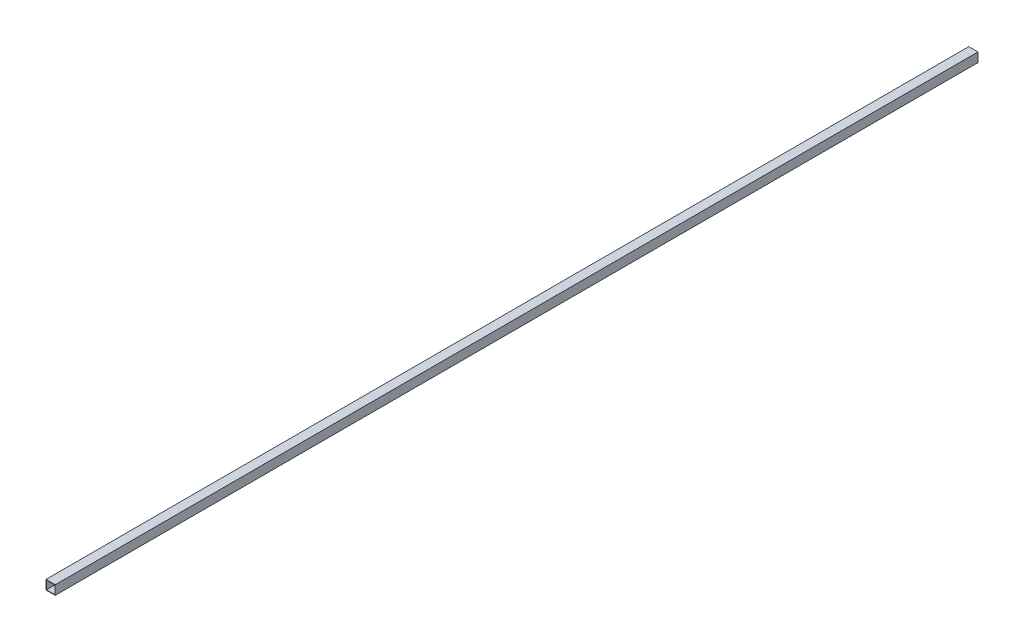
ISO-10303-21;
HEADER;
FILE_DESCRIPTION(('STEP AP214'),'2;1');
FILE_NAME('part.step','',(''),(''),'','','');
FILE_SCHEMA(('AUTOMOTIVE_DESIGN { 1 0 10303 214 1 1 1 1 }'));
ENDSEC;
DATA;
#1=APPLICATION_CONTEXT('core data for automotive mechanical design processes');
#2=APPLICATION_PROTOCOL_DEFINITION('international standard','automotive_design',2000,#1);
#3=PRODUCT_CONTEXT('',#1,'mechanical');
#4=PRODUCT('Part','Part','',(#3));
#5=PRODUCT_RELATED_PRODUCT_CATEGORY('part','',(#4));
#6=PRODUCT_DEFINITION_FORMATION('','',#4);
#7=PRODUCT_DEFINITION_CONTEXT('part definition',#1,'design');
#8=PRODUCT_DEFINITION('design','',#6,#7);
#9=PRODUCT_DEFINITION_SHAPE('','',#8);
#10=(LENGTH_UNIT() NAMED_UNIT(*) SI_UNIT(.MILLI.,.METRE.));
#11=(NAMED_UNIT(*) PLANE_ANGLE_UNIT() SI_UNIT($,.RADIAN.));
#12=(NAMED_UNIT(*) SI_UNIT($,.STERADIAN.) SOLID_ANGLE_UNIT());
#13=UNCERTAINTY_MEASURE_WITH_UNIT(LENGTH_MEASURE(1.E-05),#10,'distance_accuracy_value','');
#14=(GEOMETRIC_REPRESENTATION_CONTEXT(3) GLOBAL_UNCERTAINTY_ASSIGNED_CONTEXT((#13)) GLOBAL_UNIT_ASSIGNED_CONTEXT((#10,
#11,#12)) REPRESENTATION_CONTEXT('',''));
#15=CARTESIAN_POINT('',(0.,0.,0.));
#16=DIRECTION('',(0.,0.,1.));
#17=DIRECTION('',(1.,0.,0.));
#18=AXIS2_PLACEMENT_3D('',#15,#16,#17);
#19=CARTESIAN_POINT('',(0.,0.,100000.));
#20=DIRECTION('',(0.,0.,-1.));
#21=DIRECTION('',(-1.,0.,0.));
#22=AXIS2_PLACEMENT_3D('',#19,#20,#21);
#23=PLANE('',#22);
#24=DIRECTION('',(0.,1.,0.));
#25=VECTOR('',#24,1.);
#26=CARTESIAN_POINT('',(500.,-500.,100000.));
#27=LINE('',#26,#25);
#28=CARTESIAN_POINT('',(500.,-500.,100000.));
#29=VERTEX_POINT('',#28);
#30=CARTESIAN_POINT('',(500.,500.,100000.));
#31=VERTEX_POINT('',#30);
#32=EDGE_CURVE('E134',#29,#31,#27,.T.);
#33=ORIENTED_EDGE('',*,*,#32,.T.);
#34=DIRECTION('',(-1.,0.,0.));
#35=VECTOR('',#34,1.);
#36=CARTESIAN_POINT('',(-500.,500.,100000.));
#37=LINE('',#36,#35);
#38=CARTESIAN_POINT('',(-500.,500.,100000.));
#39=VERTEX_POINT('',#38);
#40=EDGE_CURVE('E137',#31,#39,#37,.T.);
#41=ORIENTED_EDGE('',*,*,#40,.T.);
#42=DIRECTION('',(0.,-1.,0.));
#43=VECTOR('',#42,1.);
#44=CARTESIAN_POINT('',(-500.,-500.,100000.));
#45=LINE('',#44,#43);
#46=CARTESIAN_POINT('',(-500.,-500.,100000.));
#47=VERTEX_POINT('',#46);
#48=EDGE_CURVE('E140',#39,#47,#45,.T.);
#49=ORIENTED_EDGE('',*,*,#48,.T.);
#50=DIRECTION('',(1.,0.,0.));
#51=VECTOR('',#50,1.);
#52=CARTESIAN_POINT('',(-500.,-500.,100000.));
#53=LINE('',#52,#51);
#54=EDGE_CURVE('E142',#47,#29,#53,.T.);
#55=ORIENTED_EDGE('',*,*,#54,.T.);
#56=EDGE_LOOP('',(#33,#41,#49,#55));
#57=FACE_BOUND('',#56,.T.);
#58=DIRECTION('',(0.,-1.,0.));
#59=VECTOR('',#58,1.);
#60=CARTESIAN_POINT('',(-450.,-450.,100000.));
#61=LINE('',#60,#59);
#62=CARTESIAN_POINT('',(-450.,450.,100000.));
#63=VERTEX_POINT('',#62);
#64=CARTESIAN_POINT('',(-450.,-450.,100000.));
#65=VERTEX_POINT('',#64);
#66=EDGE_CURVE('E98',#63,#65,#61,.T.);
#67=ORIENTED_EDGE('',*,*,#66,.F.);
#68=DIRECTION('',(-1.,0.,0.));
#69=VECTOR('',#68,1.);
#70=CARTESIAN_POINT('',(-450.,450.,100000.));
#71=LINE('',#70,#69);
#72=CARTESIAN_POINT('',(450.,450.,100000.));
#73=VERTEX_POINT('',#72);
#74=EDGE_CURVE('E120',#73,#63,#71,.T.);
#75=ORIENTED_EDGE('',*,*,#74,.F.);
#76=DIRECTION('',(0.,1.,0.));
#77=VECTOR('',#76,1.);
#78=CARTESIAN_POINT('',(450.,-450.,100000.));
#79=LINE('',#78,#77);
#80=CARTESIAN_POINT('',(450.,-450.,100000.));
#81=VERTEX_POINT('',#80);
#82=EDGE_CURVE('E118',#81,#73,#79,.T.);
#83=ORIENTED_EDGE('',*,*,#82,.F.);
#84=DIRECTION('',(1.,0.,0.));
#85=VECTOR('',#84,1.);
#86=CARTESIAN_POINT('',(-450.,-450.,100000.));
#87=LINE('',#86,#85);
#88=EDGE_CURVE('E106',#65,#81,#87,.T.);
#89=ORIENTED_EDGE('',*,*,#88,.F.);
#90=EDGE_LOOP('',(#67,#75,#83,#89));
#91=FACE_BOUND('',#90,.T.);
#92=ADVANCED_FACE('F33',(#57,#91),#23,.F.);
#93=CARTESIAN_POINT('',(0.,0.,0.));
#94=DIRECTION('',(0.,0.,-1.));
#95=DIRECTION('',(-1.,0.,0.));
#96=AXIS2_PLACEMENT_3D('',#93,#94,#95);
#97=PLANE('',#96);
#98=DIRECTION('',(0.,1.,0.));
#99=VECTOR('',#98,1.);
#100=CARTESIAN_POINT('',(500.,-500.,0.));
#101=LINE('',#100,#99);
#102=CARTESIAN_POINT('',(500.,-500.,0.));
#103=VERTEX_POINT('',#102);
#104=CARTESIAN_POINT('',(500.,500.,0.));
#105=VERTEX_POINT('',#104);
#106=EDGE_CURVE('E114',#103,#105,#101,.T.);
#107=ORIENTED_EDGE('',*,*,#106,.F.);
#108=DIRECTION('',(1.,0.,0.));
#109=VECTOR('',#108,1.);
#110=CARTESIAN_POINT('',(-500.,-500.,0.));
#111=LINE('',#110,#109);
#112=CARTESIAN_POINT('',(-500.,-500.,0.));
#113=VERTEX_POINT('',#112);
#114=EDGE_CURVE('E138',#113,#103,#111,.T.);
#115=ORIENTED_EDGE('',*,*,#114,.F.);
#116=DIRECTION('',(0.,-1.,0.));
#117=VECTOR('',#116,1.);
#118=CARTESIAN_POINT('',(-500.,-500.,0.));
#119=LINE('',#118,#117);
#120=CARTESIAN_POINT('',(-500.,500.,0.));
#121=VERTEX_POINT('',#120);
#122=EDGE_CURVE('E149',#121,#113,#119,.T.);
#123=ORIENTED_EDGE('',*,*,#122,.F.);
#124=DIRECTION('',(-1.,0.,0.));
#125=VECTOR('',#124,1.);
#126=CARTESIAN_POINT('',(-500.,500.,0.));
#127=LINE('',#126,#125);
#128=EDGE_CURVE('E147',#105,#121,#127,.T.);
#129=ORIENTED_EDGE('',*,*,#128,.F.);
#130=EDGE_LOOP('',(#107,#115,#123,#129));
#131=FACE_BOUND('',#130,.T.);
#132=DIRECTION('',(-1.,0.,0.));
#133=VECTOR('',#132,1.);
#134=CARTESIAN_POINT('',(-450.,450.,0.));
#135=LINE('',#134,#133);
#136=CARTESIAN_POINT('',(450.,450.,0.));
#137=VERTEX_POINT('',#136);
#138=CARTESIAN_POINT('',(-450.,450.,0.));
#139=VERTEX_POINT('',#138);
#140=EDGE_CURVE('E107',#137,#139,#135,.T.);
#141=ORIENTED_EDGE('',*,*,#140,.T.);
#142=DIRECTION('',(0.,-1.,0.));
#143=VECTOR('',#142,1.);
#144=CARTESIAN_POINT('',(-450.,-450.,0.));
#145=LINE('',#144,#143);
#146=CARTESIAN_POINT('',(-450.,-450.,0.));
#147=VERTEX_POINT('',#146);
#148=EDGE_CURVE('E56',#139,#147,#145,.T.);
#149=ORIENTED_EDGE('',*,*,#148,.T.);
#150=DIRECTION('',(1.,0.,0.));
#151=VECTOR('',#150,1.);
#152=CARTESIAN_POINT('',(-450.,-450.,0.));
#153=LINE('',#152,#151);
#154=CARTESIAN_POINT('',(450.,-450.,0.));
#155=VERTEX_POINT('',#154);
#156=EDGE_CURVE('E113',#147,#155,#153,.T.);
#157=ORIENTED_EDGE('',*,*,#156,.T.);
#158=DIRECTION('',(0.,1.,0.));
#159=VECTOR('',#158,1.);
#160=CARTESIAN_POINT('',(450.,-450.,0.));
#161=LINE('',#160,#159);
#162=EDGE_CURVE('E126',#155,#137,#161,.T.);
#163=ORIENTED_EDGE('',*,*,#162,.T.);
#164=EDGE_LOOP('',(#141,#149,#157,#163));
#165=FACE_BOUND('',#164,.T.);
#166=ADVANCED_FACE('F167',(#131,#165),#97,.T.);
#167=CARTESIAN_POINT('',(500.,-500.,100000.));
#168=DIRECTION('',(-1.,0.,0.));
#169=DIRECTION('',(0.,0.,1.));
#170=AXIS2_PLACEMENT_3D('',#167,#168,#169);
#171=PLANE('',#170);
#172=ORIENTED_EDGE('',*,*,#106,.T.);
#173=DIRECTION('',(0.,0.,-1.));
#174=VECTOR('',#173,1.);
#175=CARTESIAN_POINT('',(500.,500.,100000.));
#176=LINE('',#175,#174);
#177=EDGE_CURVE('E11',#31,#105,#176,.T.);
#178=ORIENTED_EDGE('',*,*,#177,.F.);
#179=ORIENTED_EDGE('',*,*,#32,.F.);
#180=DIRECTION('',(0.,0.,-1.));
#181=VECTOR('',#180,1.);
#182=CARTESIAN_POINT('',(500.,-500.,100000.));
#183=LINE('',#182,#181);
#184=EDGE_CURVE('E144',#29,#103,#183,.T.);
#185=ORIENTED_EDGE('',*,*,#184,.T.);
#186=EDGE_LOOP('',(#172,#178,#179,#185));
#187=FACE_BOUND('',#186,.T.);
#188=ADVANCED_FACE('F35',(#187),#171,.F.);
#189=CARTESIAN_POINT('',(-500.,500.,100000.));
#190=DIRECTION('',(0.,-1.,0.));
#191=DIRECTION('',(0.,0.,-1.));
#192=AXIS2_PLACEMENT_3D('',#189,#190,#191);
#193=PLANE('',#192);
#194=ORIENTED_EDGE('',*,*,#128,.T.);
#195=DIRECTION('',(0.,0.,-1.));
#196=VECTOR('',#195,1.);
#197=CARTESIAN_POINT('',(-500.,500.,100000.));
#198=LINE('',#197,#196);
#199=EDGE_CURVE('E41',#39,#121,#198,.T.);
#200=ORIENTED_EDGE('',*,*,#199,.F.);
#201=ORIENTED_EDGE('',*,*,#40,.F.);
#202=ORIENTED_EDGE('',*,*,#177,.T.);
#203=EDGE_LOOP('',(#194,#200,#201,#202));
#204=FACE_BOUND('',#203,.T.);
#205=ADVANCED_FACE('F177',(#204),#193,.F.);
#206=CARTESIAN_POINT('',(-500.,-500.,100000.));
#207=DIRECTION('',(1.,0.,0.));
#208=DIRECTION('',(0.,0.,-1.));
#209=AXIS2_PLACEMENT_3D('',#206,#207,#208);
#210=PLANE('',#209);
#211=ORIENTED_EDGE('',*,*,#122,.T.);
#212=DIRECTION('',(0.,0.,-1.));
#213=VECTOR('',#212,1.);
#214=CARTESIAN_POINT('',(-500.,-500.,100000.));
#215=LINE('',#214,#213);
#216=EDGE_CURVE('E154',#47,#113,#215,.T.);
#217=ORIENTED_EDGE('',*,*,#216,.F.);
#218=ORIENTED_EDGE('',*,*,#48,.F.);
#219=ORIENTED_EDGE('',*,*,#199,.T.);
#220=EDGE_LOOP('',(#211,#217,#218,#219));
#221=FACE_BOUND('',#220,.T.);
#222=ADVANCED_FACE('F161',(#221),#210,.F.);
#223=CARTESIAN_POINT('',(-500.,-500.,100000.));
#224=DIRECTION('',(0.,1.,0.));
#225=DIRECTION('',(0.,0.,1.));
#226=AXIS2_PLACEMENT_3D('',#223,#224,#225);
#227=PLANE('',#226);
#228=ORIENTED_EDGE('',*,*,#114,.T.);
#229=ORIENTED_EDGE('',*,*,#184,.F.);
#230=ORIENTED_EDGE('',*,*,#54,.F.);
#231=ORIENTED_EDGE('',*,*,#216,.T.);
#232=EDGE_LOOP('',(#228,#229,#230,#231));
#233=FACE_BOUND('',#232,.T.);
#234=ADVANCED_FACE('F171',(#233),#227,.F.);
#235=CARTESIAN_POINT('',(-450.,-450.,100000.));
#236=DIRECTION('',(1.,0.,0.));
#237=DIRECTION('',(0.,0.,-1.));
#238=AXIS2_PLACEMENT_3D('',#235,#236,#237);
#239=PLANE('',#238);
#240=ORIENTED_EDGE('',*,*,#148,.F.);
#241=DIRECTION('',(0.,0.,-1.));
#242=VECTOR('',#241,1.);
#243=CARTESIAN_POINT('',(-450.,450.,100000.));
#244=LINE('',#243,#242);
#245=EDGE_CURVE('E102',#63,#139,#244,.T.);
#246=ORIENTED_EDGE('',*,*,#245,.F.);
#247=ORIENTED_EDGE('',*,*,#66,.T.);
#248=DIRECTION('',(0.,0.,-1.));
#249=VECTOR('',#248,1.);
#250=CARTESIAN_POINT('',(-450.,-450.,100000.));
#251=LINE('',#250,#249);
#252=EDGE_CURVE('E101',#65,#147,#251,.T.);
#253=ORIENTED_EDGE('',*,*,#252,.T.);
#254=EDGE_LOOP('',(#240,#246,#247,#253));
#255=FACE_BOUND('',#254,.T.);
#256=ADVANCED_FACE('F100',(#255),#239,.T.);
#257=CARTESIAN_POINT('',(-450.,-450.,100000.));
#258=DIRECTION('',(0.,1.,0.));
#259=DIRECTION('',(0.,0.,1.));
#260=AXIS2_PLACEMENT_3D('',#257,#258,#259);
#261=PLANE('',#260);
#262=ORIENTED_EDGE('',*,*,#156,.F.);
#263=ORIENTED_EDGE('',*,*,#252,.F.);
#264=ORIENTED_EDGE('',*,*,#88,.T.);
#265=DIRECTION('',(0.,0.,-1.));
#266=VECTOR('',#265,1.);
#267=CARTESIAN_POINT('',(450.,-450.,100000.));
#268=LINE('',#267,#266);
#269=EDGE_CURVE('E115',#81,#155,#268,.T.);
#270=ORIENTED_EDGE('',*,*,#269,.T.);
#271=EDGE_LOOP('',(#262,#263,#264,#270));
#272=FACE_BOUND('',#271,.T.);
#273=ADVANCED_FACE('F110',(#272),#261,.T.);
#274=CARTESIAN_POINT('',(450.,-450.,100000.));
#275=DIRECTION('',(-1.,0.,0.));
#276=DIRECTION('',(0.,-1.,0.));
#277=AXIS2_PLACEMENT_3D('',#274,#275,#276);
#278=PLANE('',#277);
#279=ORIENTED_EDGE('',*,*,#162,.F.);
#280=ORIENTED_EDGE('',*,*,#269,.F.);
#281=ORIENTED_EDGE('',*,*,#82,.T.);
#282=DIRECTION('',(0.,0.,-1.));
#283=VECTOR('',#282,1.);
#284=CARTESIAN_POINT('',(450.,450.,100000.));
#285=LINE('',#284,#283);
#286=EDGE_CURVE('E48',#73,#137,#285,.T.);
#287=ORIENTED_EDGE('',*,*,#286,.T.);
#288=EDGE_LOOP('',(#279,#280,#281,#287));
#289=FACE_BOUND('',#288,.T.);
#290=ADVANCED_FACE('F200',(#289),#278,.T.);
#291=CARTESIAN_POINT('',(-450.,450.,100000.));
#292=DIRECTION('',(0.,-1.,0.));
#293=DIRECTION('',(1.,0.,0.));
#294=AXIS2_PLACEMENT_3D('',#291,#292,#293);
#295=PLANE('',#294);
#296=ORIENTED_EDGE('',*,*,#140,.F.);
#297=ORIENTED_EDGE('',*,*,#286,.F.);
#298=ORIENTED_EDGE('',*,*,#74,.T.);
#299=ORIENTED_EDGE('',*,*,#245,.T.);
#300=EDGE_LOOP('',(#296,#297,#298,#299));
#301=FACE_BOUND('',#300,.T.);
#302=ADVANCED_FACE('F204',(#301),#295,.T.);
#303=CLOSED_SHELL('',(#92,#166,#188,#205,#222,#234,#256,#273,#290,#302));
#304=MANIFOLD_SOLID_BREP('B2',#303);
#305=ADVANCED_BREP_SHAPE_REPRESENTATION('',(#18,#304),#14);
#306=SHAPE_DEFINITION_REPRESENTATION(#9,#305);
ENDSEC;
END-ISO-10303-21;
